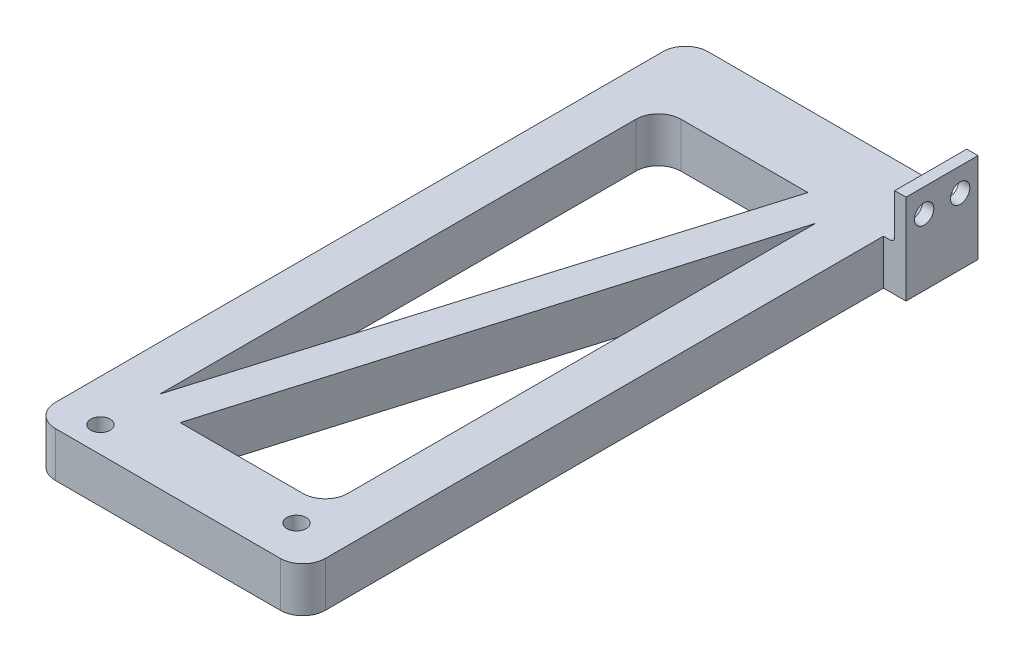
ISO-10303-21;
HEADER;
FILE_DESCRIPTION(('STEP AP214'),'2;1');
FILE_NAME('part.step','',(''),(''),'','','');
FILE_SCHEMA(('AUTOMOTIVE_DESIGN { 1 0 10303 214 1 1 1 1 }'));
ENDSEC;
DATA;
#1=APPLICATION_CONTEXT('core data for automotive mechanical design processes');
#2=APPLICATION_PROTOCOL_DEFINITION('international standard','automotive_design',2000,#1);
#3=PRODUCT_CONTEXT('',#1,'mechanical');
#4=PRODUCT('Part','Part','',(#3));
#5=PRODUCT_RELATED_PRODUCT_CATEGORY('part','',(#4));
#6=PRODUCT_DEFINITION_FORMATION('','',#4);
#7=PRODUCT_DEFINITION_CONTEXT('part definition',#1,'design');
#8=PRODUCT_DEFINITION('design','',#6,#7);
#9=PRODUCT_DEFINITION_SHAPE('','',#8);
#10=(LENGTH_UNIT() NAMED_UNIT(*) SI_UNIT(.MILLI.,.METRE.));
#11=(NAMED_UNIT(*) PLANE_ANGLE_UNIT() SI_UNIT($,.RADIAN.));
#12=(NAMED_UNIT(*) SI_UNIT($,.STERADIAN.) SOLID_ANGLE_UNIT());
#13=UNCERTAINTY_MEASURE_WITH_UNIT(LENGTH_MEASURE(1.E-05),#10,'distance_accuracy_value','');
#14=(GEOMETRIC_REPRESENTATION_CONTEXT(3) GLOBAL_UNCERTAINTY_ASSIGNED_CONTEXT((#13)) GLOBAL_UNIT_ASSIGNED_CONTEXT((#10,
#11,#12)) REPRESENTATION_CONTEXT('',''));
#15=CARTESIAN_POINT('',(0.,0.,0.));
#16=DIRECTION('',(0.,0.,1.));
#17=DIRECTION('',(1.,0.,0.));
#18=AXIS2_PLACEMENT_3D('',#15,#16,#17);
#19=CARTESIAN_POINT('',(0.,10.,0.));
#20=DIRECTION('',(0.,1.,0.));
#21=DIRECTION('',(0.,0.,1.));
#22=AXIS2_PLACEMENT_3D('',#19,#20,#21);
#23=PLANE('',#22);
#24=CARTESIAN_POINT('',(-8.01922520127492,10.,61.6900866489362));
#25=DIRECTION('',(0.,1.,0.));
#26=DIRECTION('',(0.,0.,1.));
#27=AXIS2_PLACEMENT_3D('',#24,#25,#26);
#28=CIRCLE('',#27,2.15);
#29=CARTESIAN_POINT('',(-8.01922520127492,10.,63.8400866489362));
#30=VERTEX_POINT('',#29);
#31=EDGE_CURVE('E349',#30,#30,#28,.T.);
#32=ORIENTED_EDGE('',*,*,#31,.F.);
#33=EDGE_LOOP('',(#32));
#34=FACE_BOUND('',#33,.T.);
#35=CARTESIAN_POINT('',(32.6807747987251,10.,58.8400866489359));
#36=DIRECTION('',(0.,1.,0.));
#37=DIRECTION('',(0.,0.,1.));
#38=AXIS2_PLACEMENT_3D('',#35,#36,#37);
#39=CIRCLE('',#38,2.14999999999991);
#40=CARTESIAN_POINT('',(32.6807747987251,10.,60.9900866489358));
#41=VERTEX_POINT('',#40);
#42=EDGE_CURVE('E346',#41,#41,#39,.T.);
#43=ORIENTED_EDGE('',*,*,#42,.F.);
#44=EDGE_LOOP('',(#43));
#45=FACE_BOUND('',#44,.T.);
#46=DIRECTION('',(1.,0.,0.));
#47=VECTOR('',#46,1.);
#48=CARTESIAN_POINT('',(47.6807747987251,10.,-61.5722377364675));
#49=LINE('',#48,#47);
#50=CARTESIAN_POINT('',(42.6807747987251,10.,-61.5722377364675));
#51=VERTEX_POINT('',#50);
#52=CARTESIAN_POINT('',(44.1807747987251,10.,-61.5722377364675));
#53=VERTEX_POINT('',#52);
#54=EDGE_CURVE('E254',#51,#53,#49,.T.);
#55=ORIENTED_EDGE('',*,*,#54,.T.);
#56=DIRECTION('',(0.,0.,1.));
#57=VECTOR('',#56,1.);
#58=CARTESIAN_POINT('',(44.1807747987251,10.,0.));
#59=LINE('',#58,#57);
#60=CARTESIAN_POINT('',(44.1807747987251,10.,-77.5722377364675));
#61=VERTEX_POINT('',#60);
#62=EDGE_CURVE('E60',#53,#61,#59,.F.);
#63=ORIENTED_EDGE('',*,*,#62,.T.);
#64=DIRECTION('',(-1.,0.,0.));
#65=VECTOR('',#64,1.);
#66=CARTESIAN_POINT('',(0.43115043251993,10.,-77.5722377364675));
#67=LINE('',#66,#65);
#68=CARTESIAN_POINT('',(-12.3192252012749,10.,-77.5722377364675));
#69=VERTEX_POINT('',#68);
#70=EDGE_CURVE('E256',#61,#69,#67,.T.);
#71=ORIENTED_EDGE('',*,*,#70,.T.);
#72=CARTESIAN_POINT('',(-12.3192252012749,10.,-72.5722377364675));
#73=DIRECTION('',(0.,1.,0.));
#74=DIRECTION('',(0.,0.,1.));
#75=AXIS2_PLACEMENT_3D('',#72,#73,#74);
#76=CIRCLE('',#75,5.);
#77=CARTESIAN_POINT('',(-17.3192252012749,10.,-72.5722377364675));
#78=VERTEX_POINT('',#77);
#79=EDGE_CURVE('E300',#69,#78,#76,.T.);
#80=ORIENTED_EDGE('',*,*,#79,.T.);
#81=DIRECTION('',(0.,0.,1.));
#82=VECTOR('',#81,1.);
#83=CARTESIAN_POINT('',(-17.3192252012749,10.,-77.5722377364675));
#84=LINE('',#83,#82);
#85=CARTESIAN_POINT('',(-17.3192252012749,10.,62.4277622635325));
#86=VERTEX_POINT('',#85);
#87=EDGE_CURVE('E258',#78,#86,#84,.T.);
#88=ORIENTED_EDGE('',*,*,#87,.T.);
#89=CARTESIAN_POINT('',(-12.3192252012749,10.,62.4277622635325));
#90=DIRECTION('',(0.,1.,0.));
#91=DIRECTION('',(0.,0.,1.));
#92=AXIS2_PLACEMENT_3D('',#89,#90,#91);
#93=CIRCLE('',#92,5.);
#94=CARTESIAN_POINT('',(-12.3192252012749,10.,67.4277622635325));
#95=VERTEX_POINT('',#94);
#96=EDGE_CURVE('E296',#86,#95,#93,.T.);
#97=ORIENTED_EDGE('',*,*,#96,.T.);
#98=DIRECTION('',(1.,0.,0.));
#99=VECTOR('',#98,1.);
#100=CARTESIAN_POINT('',(42.6807747987251,10.,67.4277622635325));
#101=LINE('',#100,#99);
#102=CARTESIAN_POINT('',(37.6807747987251,10.,67.4277622635325));
#103=VERTEX_POINT('',#102);
#104=EDGE_CURVE('E248',#95,#103,#101,.T.);
#105=ORIENTED_EDGE('',*,*,#104,.T.);
#106=CARTESIAN_POINT('',(37.6807747987251,10.,62.4277622635325));
#107=DIRECTION('',(0.,1.,0.));
#108=DIRECTION('',(0.,0.,1.));
#109=AXIS2_PLACEMENT_3D('',#106,#107,#108);
#110=CIRCLE('',#109,5.);
#111=CARTESIAN_POINT('',(42.6807747987251,10.,62.4277622635325));
#112=VERTEX_POINT('',#111);
#113=EDGE_CURVE('E298',#103,#112,#110,.T.);
#114=ORIENTED_EDGE('',*,*,#113,.T.);
#115=DIRECTION('',(0.,0.,-1.));
#116=VECTOR('',#115,1.);
#117=CARTESIAN_POINT('',(42.6807747987251,10.,57.6006607185436));
#118=LINE('',#117,#116);
#119=EDGE_CURVE('E251',#112,#51,#118,.T.);
#120=ORIENTED_EDGE('',*,*,#119,.T.);
#121=EDGE_LOOP('',(#55,#63,#71,#80,#88,#97,#105,#114,#120));
#122=FACE_BOUND('',#121,.T.);
#123=DIRECTION('',(0.287249916764534,0.,-0.957855670400697));
#124=VECTOR('',#123,1.);
#125=CARTESIAN_POINT('',(25.9063153225159,10.,-61.5722377364675));
#126=LINE('',#125,#124);
#127=CARTESIAN_POINT('',(-7.31922520127493,10.,49.2207356830136));
#128=VERTEX_POINT('',#127);
#129=CARTESIAN_POINT('',(25.9063153225159,10.,-61.5722377364675));
#130=VERTEX_POINT('',#129);
#131=EDGE_CURVE('E229',#128,#130,#126,.T.);
#132=ORIENTED_EDGE('',*,*,#131,.F.);
#133=DIRECTION('',(0.,0.,1.));
#134=VECTOR('',#133,1.);
#135=CARTESIAN_POINT('',(-7.31922520127494,10.,-61.5722377364675));
#136=LINE('',#135,#134);
#137=CARTESIAN_POINT('',(-7.31922520127494,10.,-56.5722377364675));
#138=VERTEX_POINT('',#137);
#139=EDGE_CURVE('E227',#138,#128,#136,.T.);
#140=ORIENTED_EDGE('',*,*,#139,.F.);
#141=CARTESIAN_POINT('',(-2.31922520127495,10.,-56.5722377364675));
#142=DIRECTION('',(0.,1.,0.));
#143=DIRECTION('',(0.,0.,1.));
#144=AXIS2_PLACEMENT_3D('',#141,#142,#143);
#145=CIRCLE('',#144,5.);
#146=CARTESIAN_POINT('',(-2.31922520127495,10.,-61.5722377364675));
#147=VERTEX_POINT('',#146);
#148=EDGE_CURVE('E322',#138,#147,#145,.F.);
#149=ORIENTED_EDGE('',*,*,#148,.T.);
#150=DIRECTION('',(-1.,0.,0.));
#151=VECTOR('',#150,1.);
#152=CARTESIAN_POINT('',(25.9063153225159,10.,-61.5722377364675));
#153=LINE('',#152,#151);
#154=EDGE_CURVE('E233',#130,#147,#153,.T.);
#155=ORIENTED_EDGE('',*,*,#154,.F.);
#156=EDGE_LOOP('',(#132,#140,#149,#155));
#157=FACE_BOUND('',#156,.T.);
#158=DIRECTION('',(-0.283864386607897,0.,0.958864437767781));
#159=VECTOR('',#158,1.);
#160=CARTESIAN_POINT('',(32.6807747987251,10.,-56.5081218945514));
#161=LINE('',#160,#159);
#162=CARTESIAN_POINT('',(32.6807747987251,10.,-56.5081218945514));
#163=VERTEX_POINT('',#162);
#164=CARTESIAN_POINT('',(0.431150432519948,10.,52.4277622635325));
#165=VERTEX_POINT('',#164);
#166=EDGE_CURVE('E210',#163,#165,#161,.T.);
#167=ORIENTED_EDGE('',*,*,#166,.F.);
#168=DIRECTION('',(0.,0.,-1.));
#169=VECTOR('',#168,1.);
#170=CARTESIAN_POINT('',(32.6807747987251,10.,52.4277622635325));
#171=LINE('',#170,#169);
#172=CARTESIAN_POINT('',(32.6807747987251,10.,47.4277622635325));
#173=VERTEX_POINT('',#172);
#174=EDGE_CURVE('E208',#173,#163,#171,.T.);
#175=ORIENTED_EDGE('',*,*,#174,.F.);
#176=CARTESIAN_POINT('',(27.6807747987251,10.,47.4277622635325));
#177=DIRECTION('',(0.,1.,0.));
#178=DIRECTION('',(0.,0.,1.));
#179=AXIS2_PLACEMENT_3D('',#176,#177,#178);
#180=CIRCLE('',#179,5.);
#181=CARTESIAN_POINT('',(27.6807747987251,10.,52.4277622635325));
#182=VERTEX_POINT('',#181);
#183=EDGE_CURVE('E326',#173,#182,#180,.F.);
#184=ORIENTED_EDGE('',*,*,#183,.T.);
#185=DIRECTION('',(1.,0.,0.));
#186=VECTOR('',#185,1.);
#187=CARTESIAN_POINT('',(0.431150432519948,10.,52.4277622635325));
#188=LINE('',#187,#186);
#189=EDGE_CURVE('E214',#165,#182,#188,.T.);
#190=ORIENTED_EDGE('',*,*,#189,.F.);
#191=EDGE_LOOP('',(#167,#175,#184,#190));
#192=FACE_BOUND('',#191,.T.);
#193=ADVANCED_FACE('F39',(#34,#45,#122,#157,#192),#23,.T.);
#194=CARTESIAN_POINT('',(0.,0.,0.));
#195=DIRECTION('',(0.,1.,0.));
#196=DIRECTION('',(0.,0.,1.));
#197=AXIS2_PLACEMENT_3D('',#194,#195,#196);
#198=PLANE('',#197);
#199=CARTESIAN_POINT('',(-8.01922520127492,0.,61.6900866489362));
#200=DIRECTION('',(0.,1.,0.));
#201=DIRECTION('',(0.,0.,1.));
#202=AXIS2_PLACEMENT_3D('',#199,#200,#201);
#203=CIRCLE('',#202,2.15);
#204=CARTESIAN_POINT('',(-8.01922520127492,0.,63.8400866489362));
#205=VERTEX_POINT('',#204);
#206=EDGE_CURVE('E341',#205,#205,#203,.F.);
#207=ORIENTED_EDGE('',*,*,#206,.F.);
#208=EDGE_LOOP('',(#207));
#209=FACE_BOUND('',#208,.T.);
#210=CARTESIAN_POINT('',(32.6807747987251,0.,58.8400866489359));
#211=DIRECTION('',(0.,1.,0.));
#212=DIRECTION('',(0.,0.,1.));
#213=AXIS2_PLACEMENT_3D('',#210,#211,#212);
#214=CIRCLE('',#213,2.14999999999991);
#215=CARTESIAN_POINT('',(32.6807747987251,0.,60.9900866489358));
#216=VERTEX_POINT('',#215);
#217=EDGE_CURVE('E350',#216,#216,#214,.F.);
#218=ORIENTED_EDGE('',*,*,#217,.F.);
#219=EDGE_LOOP('',(#218));
#220=FACE_BOUND('',#219,.T.);
#221=DIRECTION('',(-1.,0.,0.));
#222=VECTOR('',#221,1.);
#223=CARTESIAN_POINT('',(25.9063153225159,0.,-61.5722377364675));
#224=LINE('',#223,#222);
#225=CARTESIAN_POINT('',(25.9063153225159,0.,-61.5722377364675));
#226=VERTEX_POINT('',#225);
#227=CARTESIAN_POINT('',(-2.31922520127495,0.,-61.5722377364675));
#228=VERTEX_POINT('',#227);
#229=EDGE_CURVE('E230',#226,#228,#224,.T.);
#230=ORIENTED_EDGE('',*,*,#229,.T.);
#231=CARTESIAN_POINT('',(-2.31922520127495,0.,-56.5722377364675));
#232=DIRECTION('',(0.,1.,0.));
#233=DIRECTION('',(0.,0.,1.));
#234=AXIS2_PLACEMENT_3D('',#231,#232,#233);
#235=CIRCLE('',#234,5.);
#236=CARTESIAN_POINT('',(-7.31922520127494,0.,-56.5722377364675));
#237=VERTEX_POINT('',#236);
#238=EDGE_CURVE('E320',#228,#237,#235,.T.);
#239=ORIENTED_EDGE('',*,*,#238,.T.);
#240=DIRECTION('',(0.,0.,1.));
#241=VECTOR('',#240,1.);
#242=CARTESIAN_POINT('',(-7.31922520127494,0.,-61.5722377364675));
#243=LINE('',#242,#241);
#244=CARTESIAN_POINT('',(-7.31922520127493,0.,49.2207356830136));
#245=VERTEX_POINT('',#244);
#246=EDGE_CURVE('E226',#237,#245,#243,.T.);
#247=ORIENTED_EDGE('',*,*,#246,.T.);
#248=DIRECTION('',(0.287249916764534,0.,-0.957855670400697));
#249=VECTOR('',#248,1.);
#250=CARTESIAN_POINT('',(25.9063153225159,0.,-61.5722377364675));
#251=LINE('',#250,#249);
#252=EDGE_CURVE('E238',#245,#226,#251,.T.);
#253=ORIENTED_EDGE('',*,*,#252,.T.);
#254=EDGE_LOOP('',(#230,#239,#247,#253));
#255=FACE_BOUND('',#254,.T.);
#256=DIRECTION('',(0.,0.,1.));
#257=VECTOR('',#256,1.);
#258=CARTESIAN_POINT('',(-17.3192252012749,0.,-77.5722377364675));
#259=LINE('',#258,#257);
#260=CARTESIAN_POINT('',(-17.3192252012749,0.,-72.5722377364675));
#261=VERTEX_POINT('',#260);
#262=CARTESIAN_POINT('',(-17.3192252012749,0.,62.4277622635325));
#263=VERTEX_POINT('',#262);
#264=EDGE_CURVE('E270',#261,#263,#259,.T.);
#265=ORIENTED_EDGE('',*,*,#264,.F.);
#266=CARTESIAN_POINT('',(-12.3192252012749,0.,-72.5722377364675));
#267=DIRECTION('',(0.,1.,0.));
#268=DIRECTION('',(0.,0.,1.));
#269=AXIS2_PLACEMENT_3D('',#266,#267,#268);
#270=CIRCLE('',#269,5.);
#271=CARTESIAN_POINT('',(-12.3192252012749,0.,-77.5722377364675));
#272=VERTEX_POINT('',#271);
#273=EDGE_CURVE('E291',#261,#272,#270,.F.);
#274=ORIENTED_EDGE('',*,*,#273,.T.);
#275=DIRECTION('',(-1.,0.,0.));
#276=VECTOR('',#275,1.);
#277=CARTESIAN_POINT('',(-17.3192252012749,0.,-77.5722377364675));
#278=LINE('',#277,#276);
#279=CARTESIAN_POINT('',(47.6807747987251,0.,-77.5722377364675));
#280=VERTEX_POINT('',#279);
#281=EDGE_CURVE('E268',#280,#272,#278,.T.);
#282=ORIENTED_EDGE('',*,*,#281,.F.);
#283=DIRECTION('',(0.,0.,-1.));
#284=VECTOR('',#283,1.);
#285=CARTESIAN_POINT('',(47.6807747987251,0.,-77.5722377364675));
#286=LINE('',#285,#284);
#287=CARTESIAN_POINT('',(47.6807747987251,0.,-61.5722377364675));
#288=VERTEX_POINT('',#287);
#289=EDGE_CURVE('E265',#288,#280,#286,.T.);
#290=ORIENTED_EDGE('',*,*,#289,.F.);
#291=DIRECTION('',(1.,0.,0.));
#292=VECTOR('',#291,1.);
#293=CARTESIAN_POINT('',(47.6807747987251,0.,-61.5722377364675));
#294=LINE('',#293,#292);
#295=CARTESIAN_POINT('',(42.6807747987251,0.,-61.5722377364675));
#296=VERTEX_POINT('',#295);
#297=EDGE_CURVE('E263',#296,#288,#294,.T.);
#298=ORIENTED_EDGE('',*,*,#297,.F.);
#299=DIRECTION('',(0.,0.,-1.));
#300=VECTOR('',#299,1.);
#301=CARTESIAN_POINT('',(42.6807747987251,0.,-61.5722377364675));
#302=LINE('',#301,#300);
#303=CARTESIAN_POINT('',(42.6807747987251,0.,62.4277622635325));
#304=VERTEX_POINT('',#303);
#305=EDGE_CURVE('E247',#304,#296,#302,.T.);
#306=ORIENTED_EDGE('',*,*,#305,.F.);
#307=CARTESIAN_POINT('',(37.6807747987251,0.,62.4277622635325));
#308=DIRECTION('',(0.,1.,0.));
#309=DIRECTION('',(0.,0.,1.));
#310=AXIS2_PLACEMENT_3D('',#307,#308,#309);
#311=CIRCLE('',#310,5.);
#312=CARTESIAN_POINT('',(37.6807747987251,0.,67.4277622635325));
#313=VERTEX_POINT('',#312);
#314=EDGE_CURVE('E289',#304,#313,#311,.F.);
#315=ORIENTED_EDGE('',*,*,#314,.T.);
#316=DIRECTION('',(1.,0.,0.));
#317=VECTOR('',#316,1.);
#318=CARTESIAN_POINT('',(-17.3192252012749,0.,67.4277622635325));
#319=LINE('',#318,#317);
#320=CARTESIAN_POINT('',(-12.3192252012749,0.,67.4277622635325));
#321=VERTEX_POINT('',#320);
#322=EDGE_CURVE('E252',#321,#313,#319,.T.);
#323=ORIENTED_EDGE('',*,*,#322,.F.);
#324=CARTESIAN_POINT('',(-12.3192252012749,0.,62.4277622635325));
#325=DIRECTION('',(0.,1.,0.));
#326=DIRECTION('',(0.,0.,1.));
#327=AXIS2_PLACEMENT_3D('',#324,#325,#326);
#328=CIRCLE('',#327,5.);
#329=EDGE_CURVE('E287',#321,#263,#328,.F.);
#330=ORIENTED_EDGE('',*,*,#329,.T.);
#331=EDGE_LOOP('',(#265,#274,#282,#290,#298,#306,#315,#323,#330));
#332=FACE_BOUND('',#331,.T.);
#333=DIRECTION('',(1.,0.,0.));
#334=VECTOR('',#333,1.);
#335=CARTESIAN_POINT('',(0.431150432519948,0.,52.4277622635325));
#336=LINE('',#335,#334);
#337=CARTESIAN_POINT('',(0.431150432519948,0.,52.4277622635325));
#338=VERTEX_POINT('',#337);
#339=CARTESIAN_POINT('',(27.6807747987251,0.,52.4277622635325));
#340=VERTEX_POINT('',#339);
#341=EDGE_CURVE('E211',#338,#340,#336,.T.);
#342=ORIENTED_EDGE('',*,*,#341,.T.);
#343=CARTESIAN_POINT('',(27.6807747987251,0.,47.4277622635325));
#344=DIRECTION('',(0.,1.,0.));
#345=DIRECTION('',(0.,0.,1.));
#346=AXIS2_PLACEMENT_3D('',#343,#344,#345);
#347=CIRCLE('',#346,5.);
#348=CARTESIAN_POINT('',(32.6807747987251,0.,47.4277622635325));
#349=VERTEX_POINT('',#348);
#350=EDGE_CURVE('E324',#340,#349,#347,.T.);
#351=ORIENTED_EDGE('',*,*,#350,.T.);
#352=DIRECTION('',(0.,0.,-1.));
#353=VECTOR('',#352,1.);
#354=CARTESIAN_POINT('',(32.6807747987251,0.,52.4277622635325));
#355=LINE('',#354,#353);
#356=CARTESIAN_POINT('',(32.6807747987251,0.,-56.5081218945514));
#357=VERTEX_POINT('',#356);
#358=EDGE_CURVE('E201',#349,#357,#355,.T.);
#359=ORIENTED_EDGE('',*,*,#358,.T.);
#360=DIRECTION('',(-0.283864386607897,0.,0.958864437767781));
#361=VECTOR('',#360,1.);
#362=CARTESIAN_POINT('',(32.6807747987251,0.,-56.5081218945514));
#363=LINE('',#362,#361);
#364=EDGE_CURVE('E203',#357,#338,#363,.T.);
#365=ORIENTED_EDGE('',*,*,#364,.T.);
#366=EDGE_LOOP('',(#342,#351,#359,#365));
#367=FACE_BOUND('',#366,.T.);
#368=ADVANCED_FACE('F363',(#209,#220,#255,#332,#367),#198,.F.);
#369=CARTESIAN_POINT('',(42.6807747987251,10.,-61.5722377364675));
#370=DIRECTION('',(-1.,0.,0.));
#371=DIRECTION('',(0.,0.,1.));
#372=AXIS2_PLACEMENT_3D('',#369,#370,#371);
#373=PLANE('',#372);
#374=ORIENTED_EDGE('',*,*,#119,.F.);
#375=DIRECTION('',(0.,-1.,0.));
#376=VECTOR('',#375,1.);
#377=CARTESIAN_POINT('',(42.6807747987251,10.,62.4277622635325));
#378=LINE('',#377,#376);
#379=EDGE_CURVE('E302',#112,#304,#378,.T.);
#380=ORIENTED_EDGE('',*,*,#379,.T.);
#381=ORIENTED_EDGE('',*,*,#305,.T.);
#382=DIRECTION('',(0.,-1.,0.));
#383=VECTOR('',#382,1.);
#384=CARTESIAN_POINT('',(42.6807747987251,10.,-61.5722377364675));
#385=LINE('',#384,#383);
#386=EDGE_CURVE('E279',#51,#296,#385,.T.);
#387=ORIENTED_EDGE('',*,*,#386,.F.);
#388=EDGE_LOOP('',(#374,#380,#381,#387));
#389=FACE_BOUND('',#388,.T.);
#390=ADVANCED_FACE('F391',(#389),#373,.F.);
#391=CARTESIAN_POINT('',(47.6807747987251,10.,-61.5722377364675));
#392=DIRECTION('',(0.,0.,-1.));
#393=DIRECTION('',(-1.,0.,0.));
#394=AXIS2_PLACEMENT_3D('',#391,#392,#393);
#395=PLANE('',#394);
#396=ORIENTED_EDGE('',*,*,#297,.T.);
#397=DIRECTION('',(0.,-1.,0.));
#398=VECTOR('',#397,1.);
#399=CARTESIAN_POINT('',(47.6807747987251,10.,-61.5722377364675));
#400=LINE('',#399,#398);
#401=CARTESIAN_POINT('',(47.6807747987251,20.,-61.5722377364675));
#402=VERTEX_POINT('',#401);
#403=EDGE_CURVE('E276',#402,#288,#400,.T.);
#404=ORIENTED_EDGE('',*,*,#403,.F.);
#405=DIRECTION('',(1.,0.,0.));
#406=VECTOR('',#405,1.);
#407=CARTESIAN_POINT('',(45.1807747987251,20.,-61.5722377364675));
#408=LINE('',#407,#406);
#409=CARTESIAN_POINT('',(45.1807747987251,20.,-61.5722377364675));
#410=VERTEX_POINT('',#409);
#411=EDGE_CURVE('E186',#410,#402,#408,.T.);
#412=ORIENTED_EDGE('',*,*,#411,.F.);
#413=DIRECTION('',(0.,-1.,0.));
#414=VECTOR('',#413,1.);
#415=CARTESIAN_POINT('',(45.1807747987251,20.,-61.5722377364675));
#416=LINE('',#415,#414);
#417=CARTESIAN_POINT('',(45.1807747987251,11.,-61.5722377364675));
#418=VERTEX_POINT('',#417);
#419=EDGE_CURVE('E182',#410,#418,#416,.T.);
#420=ORIENTED_EDGE('',*,*,#419,.T.);
#421=CARTESIAN_POINT('',(44.1807747987251,11.,-61.5722377364675));
#422=DIRECTION('',(0.,0.,-1.));
#423=DIRECTION('',(-1.,0.,0.));
#424=AXIS2_PLACEMENT_3D('',#421,#422,#423);
#425=CIRCLE('',#424,1.);
#426=EDGE_CURVE('E47',#418,#53,#425,.T.);
#427=ORIENTED_EDGE('',*,*,#426,.T.);
#428=ORIENTED_EDGE('',*,*,#54,.F.);
#429=ORIENTED_EDGE('',*,*,#386,.T.);
#430=EDGE_LOOP('',(#396,#404,#412,#420,#427,#428,#429));
#431=FACE_BOUND('',#430,.T.);
#432=ADVANCED_FACE('F331',(#431),#395,.F.);
#433=CARTESIAN_POINT('',(47.6807747987251,10.,-77.5722377364675));
#434=DIRECTION('',(-1.,0.,0.));
#435=DIRECTION('',(0.,0.,1.));
#436=AXIS2_PLACEMENT_3D('',#433,#434,#435);
#437=PLANE('',#436);
#438=CARTESIAN_POINT('',(47.6807747987251,14.7525222312642,-73.6076251645777));
#439=DIRECTION('',(-1.,0.,0.));
#440=DIRECTION('',(0.,0.,1.));
#441=AXIS2_PLACEMENT_3D('',#438,#439,#440);
#442=CIRCLE('',#441,2.15);
#443=CARTESIAN_POINT('',(47.6807747987251,14.7525222312642,-71.4576251645777));
#444=VERTEX_POINT('',#443);
#445=EDGE_CURVE('E196',#444,#444,#442,.F.);
#446=ORIENTED_EDGE('',*,*,#445,.F.);
#447=EDGE_LOOP('',(#446));
#448=FACE_BOUND('',#447,.T.);
#449=CARTESIAN_POINT('',(47.6807747987251,14.7525222312642,-65.6076251645777));
#450=DIRECTION('',(-1.,0.,0.));
#451=DIRECTION('',(0.,0.,1.));
#452=AXIS2_PLACEMENT_3D('',#449,#450,#451);
#453=CIRCLE('',#452,2.15);
#454=CARTESIAN_POINT('',(47.6807747987251,14.7525222312642,-63.4576251645777));
#455=VERTEX_POINT('',#454);
#456=EDGE_CURVE('E338',#455,#455,#453,.F.);
#457=ORIENTED_EDGE('',*,*,#456,.F.);
#458=EDGE_LOOP('',(#457));
#459=FACE_BOUND('',#458,.T.);
#460=ORIENTED_EDGE('',*,*,#289,.T.);
#461=DIRECTION('',(0.,-1.,0.));
#462=VECTOR('',#461,1.);
#463=CARTESIAN_POINT('',(47.6807747987251,10.,-77.5722377364675));
#464=LINE('',#463,#462);
#465=CARTESIAN_POINT('',(47.6807747987251,20.,-77.5722377364675));
#466=VERTEX_POINT('',#465);
#467=EDGE_CURVE('E261',#466,#280,#464,.T.);
#468=ORIENTED_EDGE('',*,*,#467,.F.);
#469=DIRECTION('',(0.,0.,-1.));
#470=VECTOR('',#469,1.);
#471=CARTESIAN_POINT('',(47.6807747987251,20.,-61.5722377364675));
#472=LINE('',#471,#470);
#473=EDGE_CURVE('E193',#402,#466,#472,.T.);
#474=ORIENTED_EDGE('',*,*,#473,.F.);
#475=ORIENTED_EDGE('',*,*,#403,.T.);
#476=EDGE_LOOP('',(#460,#468,#474,#475));
#477=FACE_BOUND('',#476,.T.);
#478=ADVANCED_FACE('F416',(#448,#459,#477),#437,.F.);
#479=CARTESIAN_POINT('',(-17.3192252012749,10.,-77.5722377364675));
#480=DIRECTION('',(0.,0.,1.));
#481=DIRECTION('',(1.,0.,0.));
#482=AXIS2_PLACEMENT_3D('',#479,#480,#481);
#483=PLANE('',#482);
#484=ORIENTED_EDGE('',*,*,#281,.T.);
#485=DIRECTION('',(0.,-1.,0.));
#486=VECTOR('',#485,1.);
#487=CARTESIAN_POINT('',(-12.3192252012749,10.,-77.5722377364675));
#488=LINE('',#487,#486);
#489=EDGE_CURVE('E293',#272,#69,#488,.F.);
#490=ORIENTED_EDGE('',*,*,#489,.T.);
#491=ORIENTED_EDGE('',*,*,#70,.F.);
#492=CARTESIAN_POINT('',(44.1807747987251,11.,-77.5722377364675));
#493=DIRECTION('',(0.,0.,1.));
#494=DIRECTION('',(1.,0.,0.));
#495=AXIS2_PLACEMENT_3D('',#492,#493,#494);
#496=CIRCLE('',#495,1.);
#497=CARTESIAN_POINT('',(45.1807747987251,11.,-77.5722377364675));
#498=VERTEX_POINT('',#497);
#499=EDGE_CURVE('E11',#61,#498,#496,.T.);
#500=ORIENTED_EDGE('',*,*,#499,.T.);
#501=DIRECTION('',(0.,-1.,0.));
#502=VECTOR('',#501,1.);
#503=CARTESIAN_POINT('',(45.1807747987251,20.,-77.5722377364675));
#504=LINE('',#503,#502);
#505=CARTESIAN_POINT('',(45.1807747987251,20.,-77.5722377364675));
#506=VERTEX_POINT('',#505);
#507=EDGE_CURVE('E180',#506,#498,#504,.T.);
#508=ORIENTED_EDGE('',*,*,#507,.F.);
#509=DIRECTION('',(-1.,0.,0.));
#510=VECTOR('',#509,1.);
#511=CARTESIAN_POINT('',(47.6807747987251,20.,-77.5722377364675));
#512=LINE('',#511,#510);
#513=EDGE_CURVE('E187',#466,#506,#512,.T.);
#514=ORIENTED_EDGE('',*,*,#513,.F.);
#515=ORIENTED_EDGE('',*,*,#467,.T.);
#516=EDGE_LOOP('',(#484,#490,#491,#500,#508,#514,#515));
#517=FACE_BOUND('',#516,.T.);
#518=ADVANCED_FACE('F199',(#517),#483,.F.);
#519=CARTESIAN_POINT('',(-17.3192252012749,10.,-77.5722377364675));
#520=DIRECTION('',(1.,0.,0.));
#521=DIRECTION('',(0.,0.,-1.));
#522=AXIS2_PLACEMENT_3D('',#519,#520,#521);
#523=PLANE('',#522);
#524=ORIENTED_EDGE('',*,*,#87,.F.);
#525=DIRECTION('',(0.,-1.,0.));
#526=VECTOR('',#525,1.);
#527=CARTESIAN_POINT('',(-17.3192252012749,10.,-72.5722377364675));
#528=LINE('',#527,#526);
#529=EDGE_CURVE('E284',#78,#261,#528,.T.);
#530=ORIENTED_EDGE('',*,*,#529,.T.);
#531=ORIENTED_EDGE('',*,*,#264,.T.);
#532=DIRECTION('',(0.,-1.,0.));
#533=VECTOR('',#532,1.);
#534=CARTESIAN_POINT('',(-17.3192252012749,10.,62.4277622635325));
#535=LINE('',#534,#533);
#536=EDGE_CURVE('E282',#263,#86,#535,.F.);
#537=ORIENTED_EDGE('',*,*,#536,.T.);
#538=EDGE_LOOP('',(#524,#530,#531,#537));
#539=FACE_BOUND('',#538,.T.);
#540=ADVANCED_FACE('F409',(#539),#523,.F.);
#541=CARTESIAN_POINT('',(-17.3192252012749,10.,67.4277622635325));
#542=DIRECTION('',(0.,0.,-1.));
#543=DIRECTION('',(-1.,0.,0.));
#544=AXIS2_PLACEMENT_3D('',#541,#542,#543);
#545=PLANE('',#544);
#546=ORIENTED_EDGE('',*,*,#322,.T.);
#547=DIRECTION('',(0.,-1.,0.));
#548=VECTOR('',#547,1.);
#549=CARTESIAN_POINT('',(37.6807747987251,10.,67.4277622635325));
#550=LINE('',#549,#548);
#551=EDGE_CURVE('E308',#313,#103,#550,.F.);
#552=ORIENTED_EDGE('',*,*,#551,.T.);
#553=ORIENTED_EDGE('',*,*,#104,.F.);
#554=DIRECTION('',(0.,-1.,0.));
#555=VECTOR('',#554,1.);
#556=CARTESIAN_POINT('',(-12.3192252012749,10.,67.4277622635325));
#557=LINE('',#556,#555);
#558=EDGE_CURVE('E305',#95,#321,#557,.T.);
#559=ORIENTED_EDGE('',*,*,#558,.T.);
#560=EDGE_LOOP('',(#546,#552,#553,#559));
#561=FACE_BOUND('',#560,.T.);
#562=ADVANCED_FACE('F405',(#561),#545,.F.);
#563=CARTESIAN_POINT('',(-7.31922520127494,10.,-61.5722377364675));
#564=DIRECTION('',(1.,0.,0.));
#565=DIRECTION('',(0.,0.,-1.));
#566=AXIS2_PLACEMENT_3D('',#563,#564,#565);
#567=PLANE('',#566);
#568=ORIENTED_EDGE('',*,*,#246,.F.);
#569=DIRECTION('',(0.,-1.,0.));
#570=VECTOR('',#569,1.);
#571=CARTESIAN_POINT('',(-7.31922520127494,10.,-56.5722377364675));
#572=LINE('',#571,#570);
#573=EDGE_CURVE('E313',#237,#138,#572,.F.);
#574=ORIENTED_EDGE('',*,*,#573,.T.);
#575=ORIENTED_EDGE('',*,*,#139,.T.);
#576=DIRECTION('',(0.,-1.,0.));
#577=VECTOR('',#576,1.);
#578=CARTESIAN_POINT('',(-7.31922520127493,10.,49.2207356830136));
#579=LINE('',#578,#577);
#580=EDGE_CURVE('E244',#128,#245,#579,.T.);
#581=ORIENTED_EDGE('',*,*,#580,.T.);
#582=EDGE_LOOP('',(#568,#574,#575,#581));
#583=FACE_BOUND('',#582,.T.);
#584=ADVANCED_FACE('F408',(#583),#567,.T.);
#585=CARTESIAN_POINT('',(25.9063153225159,10.,-61.5722377364675));
#586=DIRECTION('',(-0.957855670400697,0.,-0.287249916764535));
#587=DIRECTION('',(-0.287249916764535,0.,0.957855670400697));
#588=AXIS2_PLACEMENT_3D('',#585,#586,#587);
#589=PLANE('',#588);
#590=ORIENTED_EDGE('',*,*,#252,.F.);
#591=ORIENTED_EDGE('',*,*,#580,.F.);
#592=ORIENTED_EDGE('',*,*,#131,.T.);
#593=DIRECTION('',(0.,-1.,0.));
#594=VECTOR('',#593,1.);
#595=CARTESIAN_POINT('',(25.9063153225159,10.,-61.5722377364675));
#596=LINE('',#595,#594);
#597=EDGE_CURVE('E236',#130,#226,#596,.T.);
#598=ORIENTED_EDGE('',*,*,#597,.T.);
#599=EDGE_LOOP('',(#590,#591,#592,#598));
#600=FACE_BOUND('',#599,.T.);
#601=ADVANCED_FACE('F527',(#600),#589,.T.);
#602=CARTESIAN_POINT('',(25.9063153225159,10.,-61.5722377364675));
#603=DIRECTION('',(0.,0.,1.));
#604=DIRECTION('',(1.,0.,0.));
#605=AXIS2_PLACEMENT_3D('',#602,#603,#604);
#606=PLANE('',#605);
#607=ORIENTED_EDGE('',*,*,#154,.T.);
#608=DIRECTION('',(0.,-1.,0.));
#609=VECTOR('',#608,1.);
#610=CARTESIAN_POINT('',(-2.31922520127495,0.,-61.5722377364675));
#611=LINE('',#610,#609);
#612=EDGE_CURVE('E310',#147,#228,#611,.T.);
#613=ORIENTED_EDGE('',*,*,#612,.T.);
#614=ORIENTED_EDGE('',*,*,#229,.F.);
#615=ORIENTED_EDGE('',*,*,#597,.F.);
#616=EDGE_LOOP('',(#607,#613,#614,#615));
#617=FACE_BOUND('',#616,.T.);
#618=ADVANCED_FACE('F537',(#617),#606,.T.);
#619=CARTESIAN_POINT('',(32.6807747987251,10.,52.4277622635325));
#620=DIRECTION('',(-1.,0.,0.));
#621=DIRECTION('',(0.,0.,1.));
#622=AXIS2_PLACEMENT_3D('',#619,#620,#621);
#623=PLANE('',#622);
#624=ORIENTED_EDGE('',*,*,#358,.F.);
#625=DIRECTION('',(0.,-1.,0.));
#626=VECTOR('',#625,1.);
#627=CARTESIAN_POINT('',(32.6807747987251,10.,47.4277622635325));
#628=LINE('',#627,#626);
#629=EDGE_CURVE('E318',#349,#173,#628,.F.);
#630=ORIENTED_EDGE('',*,*,#629,.T.);
#631=ORIENTED_EDGE('',*,*,#174,.T.);
#632=DIRECTION('',(0.,-1.,0.));
#633=VECTOR('',#632,1.);
#634=CARTESIAN_POINT('',(32.6807747987251,10.,-56.5081218945514));
#635=LINE('',#634,#633);
#636=EDGE_CURVE('E223',#163,#357,#635,.T.);
#637=ORIENTED_EDGE('',*,*,#636,.T.);
#638=EDGE_LOOP('',(#624,#630,#631,#637));
#639=FACE_BOUND('',#638,.T.);
#640=ADVANCED_FACE('F382',(#639),#623,.T.);
#641=CARTESIAN_POINT('',(32.6807747987251,10.,-56.5081218945514));
#642=DIRECTION('',(0.958864437767781,0.,0.283864386607897));
#643=DIRECTION('',(0.283864386607897,0.,-0.958864437767781));
#644=AXIS2_PLACEMENT_3D('',#641,#642,#643);
#645=PLANE('',#644);
#646=ORIENTED_EDGE('',*,*,#364,.F.);
#647=ORIENTED_EDGE('',*,*,#636,.F.);
#648=ORIENTED_EDGE('',*,*,#166,.T.);
#649=DIRECTION('',(0.,-1.,0.));
#650=VECTOR('',#649,1.);
#651=CARTESIAN_POINT('',(0.431150432519948,10.,52.4277622635325));
#652=LINE('',#651,#650);
#653=EDGE_CURVE('E216',#165,#338,#652,.T.);
#654=ORIENTED_EDGE('',*,*,#653,.T.);
#655=EDGE_LOOP('',(#646,#647,#648,#654));
#656=FACE_BOUND('',#655,.T.);
#657=ADVANCED_FACE('F378',(#656),#645,.T.);
#658=CARTESIAN_POINT('',(0.431150432519948,10.,52.4277622635325));
#659=DIRECTION('',(0.,0.,-1.));
#660=DIRECTION('',(-1.,0.,0.));
#661=AXIS2_PLACEMENT_3D('',#658,#659,#660);
#662=PLANE('',#661);
#663=ORIENTED_EDGE('',*,*,#189,.T.);
#664=DIRECTION('',(0.,-1.,0.));
#665=VECTOR('',#664,1.);
#666=CARTESIAN_POINT('',(27.6807747987251,0.,52.4277622635325));
#667=LINE('',#666,#665);
#668=EDGE_CURVE('E315',#182,#340,#667,.T.);
#669=ORIENTED_EDGE('',*,*,#668,.T.);
#670=ORIENTED_EDGE('',*,*,#341,.F.);
#671=ORIENTED_EDGE('',*,*,#653,.F.);
#672=EDGE_LOOP('',(#663,#669,#670,#671));
#673=FACE_BOUND('',#672,.T.);
#674=ADVANCED_FACE('F388',(#673),#662,.T.);
#675=CARTESIAN_POINT('',(45.1807747987251,20.,-77.5722377364675));
#676=DIRECTION('',(1.,0.,0.));
#677=DIRECTION('',(0.,0.,-1.));
#678=AXIS2_PLACEMENT_3D('',#675,#676,#677);
#679=PLANE('',#678);
#680=CARTESIAN_POINT('',(45.1807747987251,14.7525222312642,-73.6076251645777));
#681=DIRECTION('',(-1.,0.,0.));
#682=DIRECTION('',(0.,0.,1.));
#683=AXIS2_PLACEMENT_3D('',#680,#681,#682);
#684=CIRCLE('',#683,2.15);
#685=CARTESIAN_POINT('',(45.1807747987251,14.7525222312642,-71.4576251645777));
#686=VERTEX_POINT('',#685);
#687=EDGE_CURVE('E337',#686,#686,#684,.T.);
#688=ORIENTED_EDGE('',*,*,#687,.F.);
#689=EDGE_LOOP('',(#688));
#690=FACE_BOUND('',#689,.T.);
#691=CARTESIAN_POINT('',(45.1807747987251,14.7525222312642,-65.6076251645777));
#692=DIRECTION('',(-1.,0.,0.));
#693=DIRECTION('',(0.,0.,1.));
#694=AXIS2_PLACEMENT_3D('',#691,#692,#693);
#695=CIRCLE('',#694,2.15);
#696=CARTESIAN_POINT('',(45.1807747987251,14.7525222312642,-63.4576251645777));
#697=VERTEX_POINT('',#696);
#698=EDGE_CURVE('E334',#697,#697,#695,.T.);
#699=ORIENTED_EDGE('',*,*,#698,.F.);
#700=EDGE_LOOP('',(#699));
#701=FACE_BOUND('',#700,.T.);
#702=ORIENTED_EDGE('',*,*,#507,.T.);
#703=DIRECTION('',(0.,0.,1.));
#704=VECTOR('',#703,1.);
#705=CARTESIAN_POINT('',(45.1807747987251,11.,-77.5722377364675));
#706=LINE('',#705,#704);
#707=EDGE_CURVE('E328',#498,#418,#706,.T.);
#708=ORIENTED_EDGE('',*,*,#707,.T.);
#709=ORIENTED_EDGE('',*,*,#419,.F.);
#710=DIRECTION('',(0.,0.,1.));
#711=VECTOR('',#710,1.);
#712=CARTESIAN_POINT('',(45.1807747987251,20.,-77.5722377364675));
#713=LINE('',#712,#711);
#714=EDGE_CURVE('E175',#506,#410,#713,.T.);
#715=ORIENTED_EDGE('',*,*,#714,.F.);
#716=EDGE_LOOP('',(#702,#708,#709,#715));
#717=FACE_BOUND('',#716,.T.);
#718=ADVANCED_FACE('F177',(#690,#701,#717),#679,.F.);
#719=CARTESIAN_POINT('',(0.,20.,0.));
#720=DIRECTION('',(0.,1.,0.));
#721=DIRECTION('',(0.,0.,1.));
#722=AXIS2_PLACEMENT_3D('',#719,#720,#721);
#723=PLANE('',#722);
#724=ORIENTED_EDGE('',*,*,#513,.T.);
#725=ORIENTED_EDGE('',*,*,#714,.T.);
#726=ORIENTED_EDGE('',*,*,#411,.T.);
#727=ORIENTED_EDGE('',*,*,#473,.T.);
#728=EDGE_LOOP('',(#724,#725,#726,#727));
#729=FACE_BOUND('',#728,.T.);
#730=ADVANCED_FACE('F191',(#729),#723,.T.);
#731=CARTESIAN_POINT('',(47.6817747987251,14.7525222312642,-65.6076251645777));
#732=DIRECTION('',(-1.,0.,0.));
#733=DIRECTION('',(0.,0.,1.));
#734=AXIS2_PLACEMENT_3D('',#731,#732,#733);
#735=CYLINDRICAL_SURFACE('',#734,2.15);
#736=ORIENTED_EDGE('',*,*,#698,.T.);
#737=EDGE_LOOP('',(#736));
#738=FACE_BOUND('',#737,.T.);
#739=ORIENTED_EDGE('',*,*,#456,.T.);
#740=EDGE_LOOP('',(#739));
#741=FACE_BOUND('',#740,.T.);
#742=ADVANCED_FACE('F626',(#738,#741),#735,.F.);
#743=CARTESIAN_POINT('',(47.6817747987251,14.7525222312642,-73.6076251645777));
#744=DIRECTION('',(-1.,0.,0.));
#745=DIRECTION('',(0.,0.,1.));
#746=AXIS2_PLACEMENT_3D('',#743,#744,#745);
#747=CYLINDRICAL_SURFACE('',#746,2.15);
#748=ORIENTED_EDGE('',*,*,#687,.T.);
#749=EDGE_LOOP('',(#748));
#750=FACE_BOUND('',#749,.T.);
#751=ORIENTED_EDGE('',*,*,#445,.T.);
#752=EDGE_LOOP('',(#751));
#753=FACE_BOUND('',#752,.T.);
#754=ADVANCED_FACE('F616',(#750,#753),#747,.F.);
#755=CARTESIAN_POINT('',(32.6807747987251,-0.000999999999999265,58.8400866489359));
#756=DIRECTION('',(0.,1.,0.));
#757=DIRECTION('',(0.,0.,1.));
#758=AXIS2_PLACEMENT_3D('',#755,#756,#757);
#759=CYLINDRICAL_SURFACE('',#758,2.14999999999991);
#760=ORIENTED_EDGE('',*,*,#42,.T.);
#761=EDGE_LOOP('',(#760));
#762=FACE_BOUND('',#761,.T.);
#763=ORIENTED_EDGE('',*,*,#217,.T.);
#764=EDGE_LOOP('',(#763));
#765=FACE_BOUND('',#764,.T.);
#766=ADVANCED_FACE('F607',(#762,#765),#759,.F.);
#767=CARTESIAN_POINT('',(-8.01922520127492,-0.000999999999999265,61.6900866489362));
#768=DIRECTION('',(0.,1.,0.));
#769=DIRECTION('',(0.,0.,1.));
#770=AXIS2_PLACEMENT_3D('',#767,#768,#769);
#771=CYLINDRICAL_SURFACE('',#770,2.15);
#772=ORIENTED_EDGE('',*,*,#31,.T.);
#773=EDGE_LOOP('',(#772));
#774=FACE_BOUND('',#773,.T.);
#775=ORIENTED_EDGE('',*,*,#206,.T.);
#776=EDGE_LOOP('',(#775));
#777=FACE_BOUND('',#776,.T.);
#778=ADVANCED_FACE('F358',(#774,#777),#771,.F.);
#779=CARTESIAN_POINT('',(-12.3192252012749,10.,-72.5722377364675));
#780=DIRECTION('',(0.,-1.,0.));
#781=DIRECTION('',(0.,0.,-1.));
#782=AXIS2_PLACEMENT_3D('',#779,#780,#781);
#783=CYLINDRICAL_SURFACE('',#782,5.);
#784=ORIENTED_EDGE('',*,*,#79,.F.);
#785=ORIENTED_EDGE('',*,*,#489,.F.);
#786=ORIENTED_EDGE('',*,*,#273,.F.);
#787=ORIENTED_EDGE('',*,*,#529,.F.);
#788=EDGE_LOOP('',(#784,#785,#786,#787));
#789=FACE_BOUND('',#788,.T.);
#790=ADVANCED_FACE('F422',(#789),#783,.T.);
#791=CARTESIAN_POINT('',(37.6807747987251,10.,62.4277622635325));
#792=DIRECTION('',(0.,-1.,0.));
#793=DIRECTION('',(0.,0.,-1.));
#794=AXIS2_PLACEMENT_3D('',#791,#792,#793);
#795=CYLINDRICAL_SURFACE('',#794,5.);
#796=ORIENTED_EDGE('',*,*,#113,.F.);
#797=ORIENTED_EDGE('',*,*,#551,.F.);
#798=ORIENTED_EDGE('',*,*,#314,.F.);
#799=ORIENTED_EDGE('',*,*,#379,.F.);
#800=EDGE_LOOP('',(#796,#797,#798,#799));
#801=FACE_BOUND('',#800,.T.);
#802=ADVANCED_FACE('F425',(#801),#795,.T.);
#803=CARTESIAN_POINT('',(-12.3192252012749,10.,62.4277622635325));
#804=DIRECTION('',(0.,-1.,0.));
#805=DIRECTION('',(0.,0.,-1.));
#806=AXIS2_PLACEMENT_3D('',#803,#804,#805);
#807=CYLINDRICAL_SURFACE('',#806,5.);
#808=ORIENTED_EDGE('',*,*,#96,.F.);
#809=ORIENTED_EDGE('',*,*,#536,.F.);
#810=ORIENTED_EDGE('',*,*,#329,.F.);
#811=ORIENTED_EDGE('',*,*,#558,.F.);
#812=EDGE_LOOP('',(#808,#809,#810,#811));
#813=FACE_BOUND('',#812,.T.);
#814=ADVANCED_FACE('F429',(#813),#807,.T.);
#815=CARTESIAN_POINT('',(-2.31922520127495,10.,-56.5722377364675));
#816=DIRECTION('',(0.,1.,0.));
#817=DIRECTION('',(0.,0.,1.));
#818=AXIS2_PLACEMENT_3D('',#815,#816,#817);
#819=CYLINDRICAL_SURFACE('',#818,5.);
#820=ORIENTED_EDGE('',*,*,#148,.F.);
#821=ORIENTED_EDGE('',*,*,#573,.F.);
#822=ORIENTED_EDGE('',*,*,#238,.F.);
#823=ORIENTED_EDGE('',*,*,#612,.F.);
#824=EDGE_LOOP('',(#820,#821,#822,#823));
#825=FACE_BOUND('',#824,.T.);
#826=ADVANCED_FACE('F432',(#825),#819,.F.);
#827=CARTESIAN_POINT('',(27.6807747987251,10.,47.4277622635325));
#828=DIRECTION('',(0.,1.,0.));
#829=DIRECTION('',(0.,0.,1.));
#830=AXIS2_PLACEMENT_3D('',#827,#828,#829);
#831=CYLINDRICAL_SURFACE('',#830,5.);
#832=ORIENTED_EDGE('',*,*,#183,.F.);
#833=ORIENTED_EDGE('',*,*,#629,.F.);
#834=ORIENTED_EDGE('',*,*,#350,.F.);
#835=ORIENTED_EDGE('',*,*,#668,.F.);
#836=EDGE_LOOP('',(#832,#833,#834,#835));
#837=FACE_BOUND('',#836,.T.);
#838=ADVANCED_FACE('F385',(#837),#831,.F.);
#839=CARTESIAN_POINT('',(44.1807747987251,11.,-77.5722377364675));
#840=DIRECTION('',(0.,0.,1.));
#841=DIRECTION('',(1.,0.,0.));
#842=AXIS2_PLACEMENT_3D('',#839,#840,#841);
#843=CYLINDRICAL_SURFACE('',#842,1.);
#844=ORIENTED_EDGE('',*,*,#499,.F.);
#845=ORIENTED_EDGE('',*,*,#62,.F.);
#846=ORIENTED_EDGE('',*,*,#426,.F.);
#847=ORIENTED_EDGE('',*,*,#707,.F.);
#848=EDGE_LOOP('',(#844,#845,#846,#847));
#849=FACE_BOUND('',#848,.T.);
#850=ADVANCED_FACE('F41',(#849),#843,.F.);
#851=CLOSED_SHELL('',(#193,#368,#390,#432,#478,#518,#540,#562,#584,#601,#618,#640,#657,#674,
#718,#730,#742,#754,#766,#778,#790,#802,#814,#826,#838,#850));
#852=MANIFOLD_SOLID_BREP('B2',#851);
#853=ADVANCED_BREP_SHAPE_REPRESENTATION('',(#18,#852),#14);
#854=SHAPE_DEFINITION_REPRESENTATION(#9,#853);
ENDSEC;
END-ISO-10303-21;
